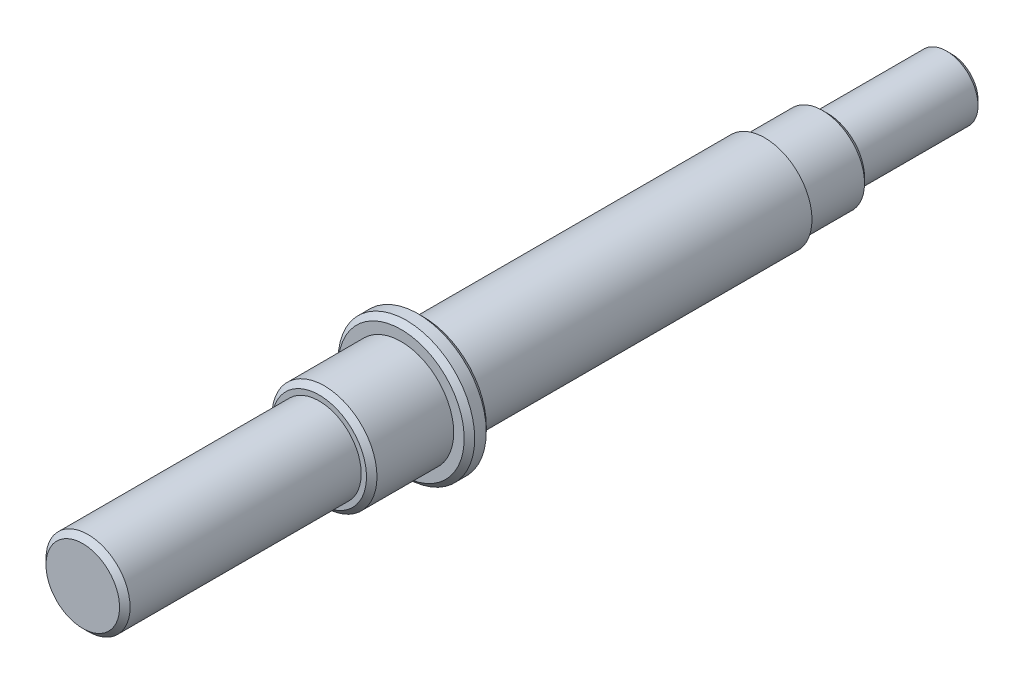
ISO-10303-21;
HEADER;
FILE_DESCRIPTION(('STEP AP214'),'2;1');
FILE_NAME('part.step','',(''),(''),'','','');
FILE_SCHEMA(('AUTOMOTIVE_DESIGN { 1 0 10303 214 1 1 1 1 }'));
ENDSEC;
DATA;
#1=APPLICATION_CONTEXT('core data for automotive mechanical design processes');
#2=APPLICATION_PROTOCOL_DEFINITION('international standard','automotive_design',2000,#1);
#3=PRODUCT_CONTEXT('',#1,'mechanical');
#4=PRODUCT('Part','Part','',(#3));
#5=PRODUCT_RELATED_PRODUCT_CATEGORY('part','',(#4));
#6=PRODUCT_DEFINITION_FORMATION('','',#4);
#7=PRODUCT_DEFINITION_CONTEXT('part definition',#1,'design');
#8=PRODUCT_DEFINITION('design','',#6,#7);
#9=PRODUCT_DEFINITION_SHAPE('','',#8);
#10=(LENGTH_UNIT() NAMED_UNIT(*) SI_UNIT(.MILLI.,.METRE.));
#11=(NAMED_UNIT(*) PLANE_ANGLE_UNIT() SI_UNIT($,.RADIAN.));
#12=(NAMED_UNIT(*) SI_UNIT($,.STERADIAN.) SOLID_ANGLE_UNIT());
#13=UNCERTAINTY_MEASURE_WITH_UNIT(LENGTH_MEASURE(1.E-05),#10,'distance_accuracy_value','');
#14=(GEOMETRIC_REPRESENTATION_CONTEXT(3) GLOBAL_UNCERTAINTY_ASSIGNED_CONTEXT((#13)) GLOBAL_UNIT_ASSIGNED_CONTEXT((#10,
#11,#12)) REPRESENTATION_CONTEXT('',''));
#15=CARTESIAN_POINT('',(0.,0.,0.));
#16=DIRECTION('',(0.,0.,1.));
#17=DIRECTION('',(1.,0.,0.));
#18=AXIS2_PLACEMENT_3D('',#15,#16,#17);
#19=CARTESIAN_POINT('',(0.,0.,24.4));
#20=DIRECTION('',(0.,0.,1.));
#21=DIRECTION('',(1.,0.,0.));
#22=AXIS2_PLACEMENT_3D('',#19,#20,#21);
#23=CYLINDRICAL_SURFACE('',#22,3.);
#24=CARTESIAN_POINT('',(0.,0.,-57.8));
#25=DIRECTION('',(0.,0.,1.));
#26=DIRECTION('',(1.,0.,0.));
#27=AXIS2_PLACEMENT_3D('',#24,#25,#26);
#28=CIRCLE('',#27,3.);
#29=CARTESIAN_POINT('',(3.,0.,-57.8));
#30=VERTEX_POINT('',#29);
#31=EDGE_CURVE('E61',#30,#30,#28,.T.);
#32=ORIENTED_EDGE('',*,*,#31,.T.);
#33=EDGE_LOOP('',(#32));
#34=FACE_BOUND('',#33,.T.);
#35=CARTESIAN_POINT('',(0.,0.,-46.5));
#36=DIRECTION('',(0.,0.,1.));
#37=DIRECTION('',(1.,0.,0.));
#38=AXIS2_PLACEMENT_3D('',#35,#36,#37);
#39=CIRCLE('',#38,3.);
#40=CARTESIAN_POINT('',(3.,0.,-46.5));
#41=VERTEX_POINT('',#40);
#42=EDGE_CURVE('E113',#41,#41,#39,.T.);
#43=ORIENTED_EDGE('',*,*,#42,.F.);
#44=EDGE_LOOP('',(#43));
#45=FACE_BOUND('',#44,.T.);
#46=ADVANCED_FACE('F53',(#34,#45),#23,.T.);
#47=CARTESIAN_POINT('',(0.,3.,-58.3));
#48=DIRECTION('',(0.,0.,1.));
#49=DIRECTION('',(1.,0.,0.));
#50=AXIS2_PLACEMENT_3D('',#47,#48,#49);
#51=PLANE('',#50);
#52=CARTESIAN_POINT('',(0.,0.,-58.3));
#53=DIRECTION('',(0.,0.,1.));
#54=DIRECTION('',(1.,0.,0.));
#55=AXIS2_PLACEMENT_3D('',#52,#53,#54);
#56=CIRCLE('',#55,2.49999999999997);
#57=CARTESIAN_POINT('',(2.49999999999997,0.,-58.3));
#58=VERTEX_POINT('',#57);
#59=EDGE_CURVE('E11',#58,#58,#56,.F.);
#60=ORIENTED_EDGE('',*,*,#59,.T.);
#61=EDGE_LOOP('',(#60));
#62=FACE_BOUND('',#61,.T.);
#63=ADVANCED_FACE('F120',(#62),#51,.F.);
#64=CARTESIAN_POINT('',(0.,4.,24.4));
#65=DIRECTION('',(0.,0.,-1.));
#66=DIRECTION('',(-1.,0.,0.));
#67=AXIS2_PLACEMENT_3D('',#64,#65,#66);
#68=PLANE('',#67);
#69=CARTESIAN_POINT('',(0.,0.,24.4));
#70=DIRECTION('',(0.,0.,-1.));
#71=DIRECTION('',(-1.,0.,0.));
#72=AXIS2_PLACEMENT_3D('',#69,#70,#71);
#73=CIRCLE('',#72,3.5);
#74=CARTESIAN_POINT('',(-3.5,0.,24.4));
#75=VERTEX_POINT('',#74);
#76=EDGE_CURVE('E95',#75,#75,#73,.F.);
#77=ORIENTED_EDGE('',*,*,#76,.T.);
#78=EDGE_LOOP('',(#77));
#79=FACE_BOUND('',#78,.T.);
#80=ADVANCED_FACE('F125',(#79),#68,.F.);
#81=CARTESIAN_POINT('',(0.,0.,24.4));
#82=DIRECTION('',(0.,0.,1.));
#83=DIRECTION('',(1.,0.,0.));
#84=AXIS2_PLACEMENT_3D('',#81,#82,#83);
#85=CYLINDRICAL_SURFACE('',#84,4.);
#86=CARTESIAN_POINT('',(0.,0.,23.9));
#87=DIRECTION('',(0.,0.,-1.));
#88=DIRECTION('',(-1.,0.,0.));
#89=AXIS2_PLACEMENT_3D('',#86,#87,#88);
#90=CIRCLE('',#89,4.);
#91=CARTESIAN_POINT('',(-4.,0.,23.9));
#92=VERTEX_POINT('',#91);
#93=EDGE_CURVE('E92',#92,#92,#90,.T.);
#94=ORIENTED_EDGE('',*,*,#93,.T.);
#95=EDGE_LOOP('',(#94));
#96=FACE_BOUND('',#95,.T.);
#97=CARTESIAN_POINT('',(0.,0.,1.9));
#98=DIRECTION('',(0.,0.,1.));
#99=DIRECTION('',(1.,0.,0.));
#100=AXIS2_PLACEMENT_3D('',#97,#98,#99);
#101=CIRCLE('',#100,4.);
#102=CARTESIAN_POINT('',(4.,0.,1.9));
#103=VERTEX_POINT('',#102);
#104=EDGE_CURVE('E98',#103,#103,#101,.T.);
#105=ORIENTED_EDGE('',*,*,#104,.T.);
#106=EDGE_LOOP('',(#105));
#107=FACE_BOUND('',#106,.T.);
#108=ADVANCED_FACE('F208',(#96,#107),#85,.T.);
#109=CARTESIAN_POINT('',(0.,4.,1.9));
#110=DIRECTION('',(0.,0.,-1.));
#111=DIRECTION('',(-1.,0.,0.));
#112=AXIS2_PLACEMENT_3D('',#109,#110,#111);
#113=PLANE('',#112);
#114=CARTESIAN_POINT('',(0.,0.,1.9));
#115=DIRECTION('',(0.,0.,-1.));
#116=DIRECTION('',(-1.,0.,0.));
#117=AXIS2_PLACEMENT_3D('',#114,#115,#116);
#118=CIRCLE('',#117,4.50000000000002);
#119=CARTESIAN_POINT('',(-4.50000000000002,0.,1.9));
#120=VERTEX_POINT('',#119);
#121=EDGE_CURVE('E89',#120,#120,#118,.F.);
#122=ORIENTED_EDGE('',*,*,#121,.T.);
#123=EDGE_LOOP('',(#122));
#124=FACE_BOUND('',#123,.T.);
#125=ORIENTED_EDGE('',*,*,#104,.F.);
#126=EDGE_LOOP('',(#125));
#127=FACE_BOUND('',#126,.T.);
#128=ADVANCED_FACE('F204',(#124,#127),#113,.F.);
#129=CARTESIAN_POINT('',(0.,0.,24.4));
#130=DIRECTION('',(0.,0.,1.));
#131=DIRECTION('',(1.,0.,0.));
#132=AXIS2_PLACEMENT_3D('',#129,#130,#131);
#133=CYLINDRICAL_SURFACE('',#132,5.);
#134=CARTESIAN_POINT('',(0.,0.,1.40000000000001));
#135=DIRECTION('',(0.,0.,-1.));
#136=DIRECTION('',(-1.,0.,0.));
#137=AXIS2_PLACEMENT_3D('',#134,#135,#136);
#138=CIRCLE('',#137,5.);
#139=CARTESIAN_POINT('',(-5.,0.,1.40000000000001));
#140=VERTEX_POINT('',#139);
#141=EDGE_CURVE('E86',#140,#140,#138,.T.);
#142=ORIENTED_EDGE('',*,*,#141,.T.);
#143=EDGE_LOOP('',(#142));
#144=FACE_BOUND('',#143,.T.);
#145=CARTESIAN_POINT('',(0.,0.,-5.9));
#146=DIRECTION('',(0.,0.,1.));
#147=DIRECTION('',(1.,0.,0.));
#148=AXIS2_PLACEMENT_3D('',#145,#146,#147);
#149=CIRCLE('',#148,5.);
#150=CARTESIAN_POINT('',(5.,0.,-5.9));
#151=VERTEX_POINT('',#150);
#152=EDGE_CURVE('E101',#151,#151,#149,.T.);
#153=ORIENTED_EDGE('',*,*,#152,.T.);
#154=EDGE_LOOP('',(#153));
#155=FACE_BOUND('',#154,.T.);
#156=ADVANCED_FACE('F200',(#144,#155),#133,.T.);
#157=CARTESIAN_POINT('',(0.,5.,-5.9));
#158=DIRECTION('',(0.,0.,-1.));
#159=DIRECTION('',(-1.,0.,0.));
#160=AXIS2_PLACEMENT_3D('',#157,#158,#159);
#161=PLANE('',#160);
#162=CARTESIAN_POINT('',(0.,0.,-5.9));
#163=DIRECTION('',(0.,0.,-1.));
#164=DIRECTION('',(-1.,0.,0.));
#165=AXIS2_PLACEMENT_3D('',#162,#163,#164);
#166=CIRCLE('',#165,5.99999999999999);
#167=CARTESIAN_POINT('',(-5.99999999999999,0.,-5.9));
#168=VERTEX_POINT('',#167);
#169=EDGE_CURVE('E83',#168,#168,#166,.F.);
#170=ORIENTED_EDGE('',*,*,#169,.T.);
#171=EDGE_LOOP('',(#170));
#172=FACE_BOUND('',#171,.T.);
#173=ORIENTED_EDGE('',*,*,#152,.F.);
#174=EDGE_LOOP('',(#173));
#175=FACE_BOUND('',#174,.T.);
#176=ADVANCED_FACE('F196',(#172,#175),#161,.F.);
#177=CARTESIAN_POINT('',(0.,0.,24.4));
#178=DIRECTION('',(0.,0.,1.));
#179=DIRECTION('',(1.,0.,0.));
#180=AXIS2_PLACEMENT_3D('',#177,#178,#179);
#181=CYLINDRICAL_SURFACE('',#180,6.5);
#182=CARTESIAN_POINT('',(0.,0.,-7.5));
#183=DIRECTION('',(0.,0.,1.));
#184=DIRECTION('',(1.,0.,0.));
#185=AXIS2_PLACEMENT_3D('',#182,#183,#184);
#186=CIRCLE('',#185,6.5);
#187=CARTESIAN_POINT('',(6.5,0.,-7.5));
#188=VERTEX_POINT('',#187);
#189=EDGE_CURVE('E77',#188,#188,#186,.T.);
#190=ORIENTED_EDGE('',*,*,#189,.T.);
#191=EDGE_LOOP('',(#190));
#192=FACE_BOUND('',#191,.T.);
#193=CARTESIAN_POINT('',(0.,0.,-6.40000000000001));
#194=DIRECTION('',(0.,0.,-1.));
#195=DIRECTION('',(-1.,0.,0.));
#196=AXIS2_PLACEMENT_3D('',#193,#194,#195);
#197=CIRCLE('',#196,6.5);
#198=CARTESIAN_POINT('',(-6.5,0.,-6.40000000000001));
#199=VERTEX_POINT('',#198);
#200=EDGE_CURVE('E80',#199,#199,#197,.T.);
#201=ORIENTED_EDGE('',*,*,#200,.T.);
#202=EDGE_LOOP('',(#201));
#203=FACE_BOUND('',#202,.T.);
#204=ADVANCED_FACE('F192',(#192,#203),#181,.T.);
#205=CARTESIAN_POINT('',(0.,6.5,-8.));
#206=DIRECTION('',(0.,0.,1.));
#207=DIRECTION('',(1.,0.,0.));
#208=AXIS2_PLACEMENT_3D('',#205,#206,#207);
#209=PLANE('',#208);
#210=CARTESIAN_POINT('',(0.,0.,-8.));
#211=DIRECTION('',(0.,0.,1.));
#212=DIRECTION('',(1.,0.,0.));
#213=AXIS2_PLACEMENT_3D('',#210,#211,#212);
#214=CIRCLE('',#213,6.);
#215=CARTESIAN_POINT('',(6.,0.,-8.));
#216=VERTEX_POINT('',#215);
#217=EDGE_CURVE('E74',#216,#216,#214,.F.);
#218=ORIENTED_EDGE('',*,*,#217,.T.);
#219=EDGE_LOOP('',(#218));
#220=FACE_BOUND('',#219,.T.);
#221=CARTESIAN_POINT('',(0.,0.,-8.));
#222=DIRECTION('',(0.,0.,1.));
#223=DIRECTION('',(1.,0.,0.));
#224=AXIS2_PLACEMENT_3D('',#221,#222,#223);
#225=CIRCLE('',#224,4.5);
#226=CARTESIAN_POINT('',(4.5,0.,-8.));
#227=VERTEX_POINT('',#226);
#228=EDGE_CURVE('E104',#227,#227,#225,.T.);
#229=ORIENTED_EDGE('',*,*,#228,.T.);
#230=EDGE_LOOP('',(#229));
#231=FACE_BOUND('',#230,.T.);
#232=ADVANCED_FACE('F184',(#220,#231),#209,.F.);
#233=CARTESIAN_POINT('',(0.,0.,24.4));
#234=DIRECTION('',(0.,0.,1.));
#235=DIRECTION('',(1.,0.,0.));
#236=AXIS2_PLACEMENT_3D('',#233,#234,#235);
#237=CYLINDRICAL_SURFACE('',#236,4.5);
#238=ORIENTED_EDGE('',*,*,#228,.F.);
#239=EDGE_LOOP('',(#238));
#240=FACE_BOUND('',#239,.T.);
#241=CARTESIAN_POINT('',(0.,0.,-40.5));
#242=DIRECTION('',(0.,0.,1.));
#243=DIRECTION('',(1.,0.,0.));
#244=AXIS2_PLACEMENT_3D('',#241,#242,#243);
#245=CIRCLE('',#244,4.5);
#246=CARTESIAN_POINT('',(4.5,0.,-40.5));
#247=VERTEX_POINT('',#246);
#248=EDGE_CURVE('E107',#247,#247,#245,.T.);
#249=ORIENTED_EDGE('',*,*,#248,.T.);
#250=EDGE_LOOP('',(#249));
#251=FACE_BOUND('',#250,.T.);
#252=ADVANCED_FACE('F178',(#240,#251),#237,.T.);
#253=CARTESIAN_POINT('',(0.,4.5,-40.5));
#254=DIRECTION('',(0.,0.,1.));
#255=DIRECTION('',(1.,0.,0.));
#256=AXIS2_PLACEMENT_3D('',#253,#254,#255);
#257=PLANE('',#256);
#258=ORIENTED_EDGE('',*,*,#248,.F.);
#259=EDGE_LOOP('',(#258));
#260=FACE_BOUND('',#259,.T.);
#261=CARTESIAN_POINT('',(0.,0.,-40.5));
#262=DIRECTION('',(0.,0.,1.));
#263=DIRECTION('',(1.,0.,0.));
#264=AXIS2_PLACEMENT_3D('',#261,#262,#263);
#265=CIRCLE('',#264,4.);
#266=CARTESIAN_POINT('',(4.,0.,-40.5));
#267=VERTEX_POINT('',#266);
#268=EDGE_CURVE('E110',#267,#267,#265,.T.);
#269=ORIENTED_EDGE('',*,*,#268,.T.);
#270=EDGE_LOOP('',(#269));
#271=FACE_BOUND('',#270,.T.);
#272=ADVANCED_FACE('F173',(#260,#271),#257,.F.);
#273=CARTESIAN_POINT('',(0.,0.,24.4));
#274=DIRECTION('',(0.,0.,1.));
#275=DIRECTION('',(1.,0.,0.));
#276=AXIS2_PLACEMENT_3D('',#273,#274,#275);
#277=CYLINDRICAL_SURFACE('',#276,4.);
#278=CARTESIAN_POINT('',(0.,0.,-46.));
#279=DIRECTION('',(0.,0.,1.));
#280=DIRECTION('',(1.,0.,0.));
#281=AXIS2_PLACEMENT_3D('',#278,#279,#280);
#282=CIRCLE('',#281,4.);
#283=CARTESIAN_POINT('',(4.,0.,-46.));
#284=VERTEX_POINT('',#283);
#285=EDGE_CURVE('E69',#284,#284,#282,.T.);
#286=ORIENTED_EDGE('',*,*,#285,.T.);
#287=EDGE_LOOP('',(#286));
#288=FACE_BOUND('',#287,.T.);
#289=ORIENTED_EDGE('',*,*,#268,.F.);
#290=EDGE_LOOP('',(#289));
#291=FACE_BOUND('',#290,.T.);
#292=ADVANCED_FACE('F170',(#288,#291),#277,.T.);
#293=CARTESIAN_POINT('',(0.,4.,-46.5));
#294=DIRECTION('',(0.,0.,1.));
#295=DIRECTION('',(1.,0.,0.));
#296=AXIS2_PLACEMENT_3D('',#293,#294,#295);
#297=PLANE('',#296);
#298=CARTESIAN_POINT('',(0.,0.,-46.5));
#299=DIRECTION('',(0.,0.,1.));
#300=DIRECTION('',(1.,0.,0.));
#301=AXIS2_PLACEMENT_3D('',#298,#299,#300);
#302=CIRCLE('',#301,3.49999999999996);
#303=CARTESIAN_POINT('',(3.49999999999996,0.,-46.5));
#304=VERTEX_POINT('',#303);
#305=EDGE_CURVE('E65',#304,#304,#302,.F.);
#306=ORIENTED_EDGE('',*,*,#305,.T.);
#307=EDGE_LOOP('',(#306));
#308=FACE_BOUND('',#307,.T.);
#309=ORIENTED_EDGE('',*,*,#42,.T.);
#310=EDGE_LOOP('',(#309));
#311=FACE_BOUND('',#310,.T.);
#312=ADVANCED_FACE('F117',(#308,#311),#297,.F.);
#313=CARTESIAN_POINT('',(0.,0.,24.4));
#314=DIRECTION('',(0.,0.,-1.));
#315=DIRECTION('',(-1.,0.,0.));
#316=AXIS2_PLACEMENT_3D('',#313,#314,#315);
#317=CONICAL_SURFACE('',#316,3.5,0.785398163397448);
#318=ORIENTED_EDGE('',*,*,#93,.F.);
#319=EDGE_LOOP('',(#318));
#320=FACE_BOUND('',#319,.T.);
#321=ORIENTED_EDGE('',*,*,#76,.F.);
#322=EDGE_LOOP('',(#321));
#323=FACE_BOUND('',#322,.T.);
#324=ADVANCED_FACE('F130',(#320,#323),#317,.T.);
#325=CARTESIAN_POINT('',(0.,0.,1.9));
#326=DIRECTION('',(0.,0.,-1.));
#327=DIRECTION('',(-1.,0.,0.));
#328=AXIS2_PLACEMENT_3D('',#325,#326,#327);
#329=CONICAL_SURFACE('',#328,4.50000000000002,0.785398163397444);
#330=ORIENTED_EDGE('',*,*,#141,.F.);
#331=EDGE_LOOP('',(#330));
#332=FACE_BOUND('',#331,.T.);
#333=ORIENTED_EDGE('',*,*,#121,.F.);
#334=EDGE_LOOP('',(#333));
#335=FACE_BOUND('',#334,.T.);
#336=ADVANCED_FACE('F136',(#332,#335),#329,.T.);
#337=CARTESIAN_POINT('',(0.,0.,-5.9));
#338=DIRECTION('',(0.,0.,-1.));
#339=DIRECTION('',(-1.,0.,0.));
#340=AXIS2_PLACEMENT_3D('',#337,#338,#339);
#341=CONICAL_SURFACE('',#340,5.99999999999999,0.785398163397453);
#342=ORIENTED_EDGE('',*,*,#200,.F.);
#343=EDGE_LOOP('',(#342));
#344=FACE_BOUND('',#343,.T.);
#345=ORIENTED_EDGE('',*,*,#169,.F.);
#346=EDGE_LOOP('',(#345));
#347=FACE_BOUND('',#346,.T.);
#348=ADVANCED_FACE('F143',(#344,#347),#341,.T.);
#349=CARTESIAN_POINT('',(0.,0.,-7.5));
#350=DIRECTION('',(0.,0.,1.));
#351=DIRECTION('',(1.,0.,0.));
#352=AXIS2_PLACEMENT_3D('',#349,#350,#351);
#353=CONICAL_SURFACE('',#352,6.5,0.78539816339745);
#354=ORIENTED_EDGE('',*,*,#217,.F.);
#355=EDGE_LOOP('',(#354));
#356=FACE_BOUND('',#355,.T.);
#357=ORIENTED_EDGE('',*,*,#189,.F.);
#358=EDGE_LOOP('',(#357));
#359=FACE_BOUND('',#358,.T.);
#360=ADVANCED_FACE('F150',(#356,#359),#353,.T.);
#361=CARTESIAN_POINT('',(0.,0.,-46.));
#362=DIRECTION('',(0.,0.,1.));
#363=DIRECTION('',(1.,0.,0.));
#364=AXIS2_PLACEMENT_3D('',#361,#362,#363);
#365=CONICAL_SURFACE('',#364,4.,0.785398163397452);
#366=ORIENTED_EDGE('',*,*,#305,.F.);
#367=EDGE_LOOP('',(#366));
#368=FACE_BOUND('',#367,.T.);
#369=ORIENTED_EDGE('',*,*,#285,.F.);
#370=EDGE_LOOP('',(#369));
#371=FACE_BOUND('',#370,.T.);
#372=ADVANCED_FACE('F156',(#368,#371),#365,.T.);
#373=CARTESIAN_POINT('',(0.,0.,-57.8));
#374=DIRECTION('',(0.,0.,1.));
#375=DIRECTION('',(1.,0.,0.));
#376=AXIS2_PLACEMENT_3D('',#373,#374,#375);
#377=CONICAL_SURFACE('',#376,3.,0.785398163397446);
#378=ORIENTED_EDGE('',*,*,#59,.F.);
#379=EDGE_LOOP('',(#378));
#380=FACE_BOUND('',#379,.T.);
#381=ORIENTED_EDGE('',*,*,#31,.F.);
#382=EDGE_LOOP('',(#381));
#383=FACE_BOUND('',#382,.T.);
#384=ADVANCED_FACE('F56',(#380,#383),#377,.T.);
#385=CLOSED_SHELL('',(#46,#63,#80,#108,#128,#156,#176,#204,#232,#252,#272,#292,#312,#324,#336,
#348,#360,#372,#384));
#386=MANIFOLD_SOLID_BREP('B2',#385);
#387=ADVANCED_BREP_SHAPE_REPRESENTATION('',(#18,#386),#14);
#388=SHAPE_DEFINITION_REPRESENTATION(#9,#387);
ENDSEC;
END-ISO-10303-21;
